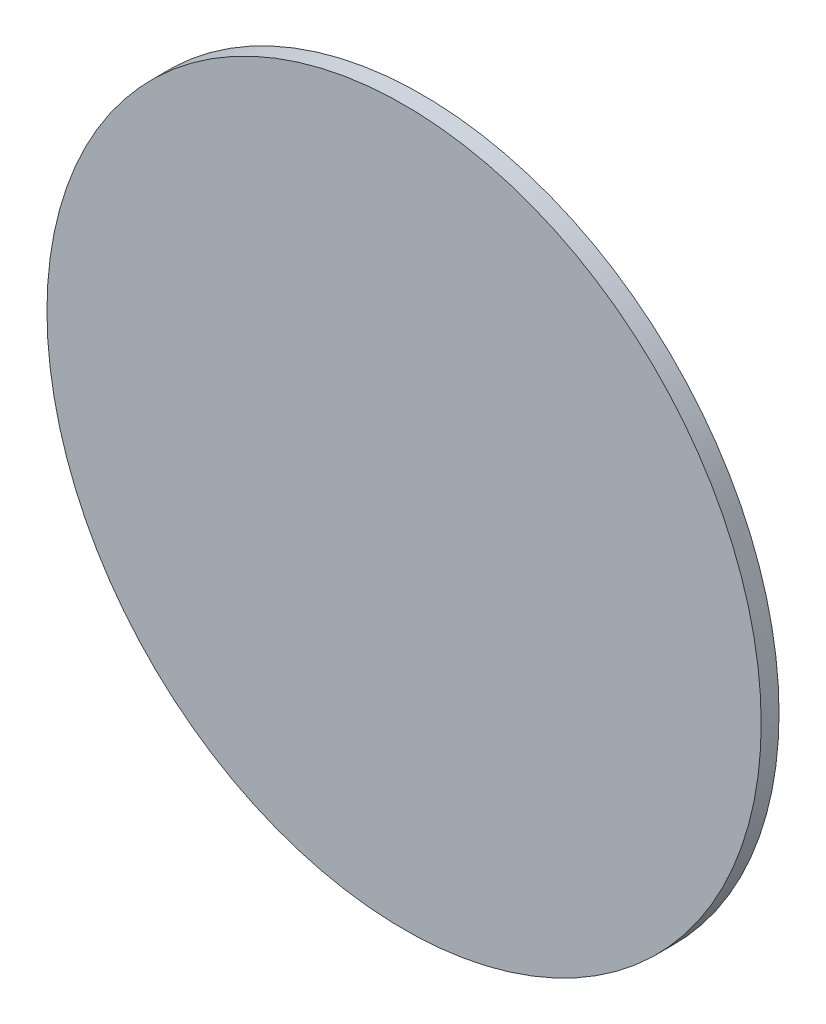
ISO-10303-21;
HEADER;
FILE_DESCRIPTION(('STEP AP214'),'2;1');
FILE_NAME('part.step','',(''),(''),'','','');
FILE_SCHEMA(('AUTOMOTIVE_DESIGN { 1 0 10303 214 1 1 1 1 }'));
ENDSEC;
DATA;
#1=APPLICATION_CONTEXT('core data for automotive mechanical design processes');
#2=APPLICATION_PROTOCOL_DEFINITION('international standard','automotive_design',2000,#1);
#3=PRODUCT_CONTEXT('',#1,'mechanical');
#4=PRODUCT('Part','Part','',(#3));
#5=PRODUCT_RELATED_PRODUCT_CATEGORY('part','',(#4));
#6=PRODUCT_DEFINITION_FORMATION('','',#4);
#7=PRODUCT_DEFINITION_CONTEXT('part definition',#1,'design');
#8=PRODUCT_DEFINITION('design','',#6,#7);
#9=PRODUCT_DEFINITION_SHAPE('','',#8);
#10=(LENGTH_UNIT() NAMED_UNIT(*) SI_UNIT(.MILLI.,.METRE.));
#11=(NAMED_UNIT(*) PLANE_ANGLE_UNIT() SI_UNIT($,.RADIAN.));
#12=(NAMED_UNIT(*) SI_UNIT($,.STERADIAN.) SOLID_ANGLE_UNIT());
#13=UNCERTAINTY_MEASURE_WITH_UNIT(LENGTH_MEASURE(1.E-05),#10,'distance_accuracy_value','');
#14=(GEOMETRIC_REPRESENTATION_CONTEXT(3) GLOBAL_UNCERTAINTY_ASSIGNED_CONTEXT((#13)) GLOBAL_UNIT_ASSIGNED_CONTEXT((#10,
#11,#12)) REPRESENTATION_CONTEXT('',''));
#15=CARTESIAN_POINT('',(0.,0.,0.));
#16=DIRECTION('',(0.,0.,1.));
#17=DIRECTION('',(1.,0.,0.));
#18=AXIS2_PLACEMENT_3D('',#15,#16,#17);
#19=CARTESIAN_POINT('',(0.,0.,1.));
#20=DIRECTION('',(0.,0.,-1.));
#21=DIRECTION('',(-1.,0.,0.));
#22=AXIS2_PLACEMENT_3D('',#19,#20,#21);
#23=CYLINDRICAL_SURFACE('',#22,20.);
#24=CARTESIAN_POINT('',(0.,0.,1.));
#25=DIRECTION('',(0.,0.,1.));
#26=DIRECTION('',(1.,0.,0.));
#27=AXIS2_PLACEMENT_3D('',#24,#25,#26);
#28=CIRCLE('',#27,20.);
#29=CARTESIAN_POINT('',(20.,0.,1.));
#30=VERTEX_POINT('',#29);
#31=EDGE_CURVE('E10',#30,#30,#28,.T.);
#32=ORIENTED_EDGE('',*,*,#31,.F.);
#33=EDGE_LOOP('',(#32));
#34=FACE_BOUND('',#33,.T.);
#35=CARTESIAN_POINT('',(0.,0.,0.));
#36=DIRECTION('',(0.,0.,1.));
#37=DIRECTION('',(1.,0.,0.));
#38=AXIS2_PLACEMENT_3D('',#35,#36,#37);
#39=CIRCLE('',#38,20.);
#40=CARTESIAN_POINT('',(20.,0.,0.));
#41=VERTEX_POINT('',#40);
#42=EDGE_CURVE('E46',#41,#41,#39,.T.);
#43=ORIENTED_EDGE('',*,*,#42,.T.);
#44=EDGE_LOOP('',(#43));
#45=FACE_BOUND('',#44,.T.);
#46=ADVANCED_FACE('F43',(#34,#45),#23,.T.);
#47=CARTESIAN_POINT('',(0.,0.,1.));
#48=DIRECTION('',(0.,0.,1.));
#49=DIRECTION('',(1.,0.,0.));
#50=AXIS2_PLACEMENT_3D('',#47,#48,#49);
#51=PLANE('',#50);
#52=ORIENTED_EDGE('',*,*,#31,.T.);
#53=EDGE_LOOP('',(#52));
#54=FACE_BOUND('',#53,.T.);
#55=ADVANCED_FACE('F58',(#54),#51,.T.);
#56=CARTESIAN_POINT('',(0.,0.,0.));
#57=DIRECTION('',(0.,0.,1.));
#58=DIRECTION('',(1.,0.,0.));
#59=AXIS2_PLACEMENT_3D('',#56,#57,#58);
#60=PLANE('',#59);
#61=ORIENTED_EDGE('',*,*,#42,.F.);
#62=EDGE_LOOP('',(#61));
#63=FACE_BOUND('',#62,.T.);
#64=ADVANCED_FACE('F56',(#63),#60,.F.);
#65=CLOSED_SHELL('',(#46,#55,#64));
#66=MANIFOLD_SOLID_BREP('B2',#65);
#67=ADVANCED_BREP_SHAPE_REPRESENTATION('',(#18,#66),#14);
#68=SHAPE_DEFINITION_REPRESENTATION(#9,#67);
ENDSEC;
END-ISO-10303-21;
